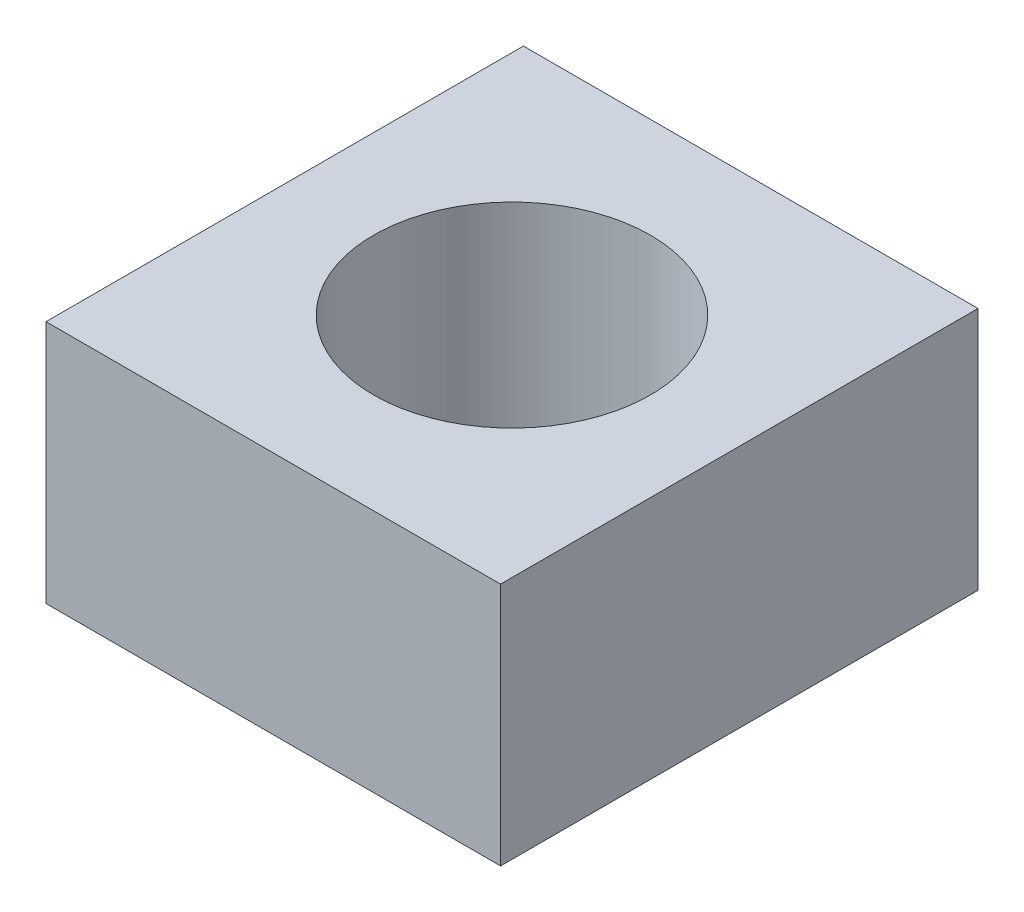
ISO-10303-21;
HEADER;
FILE_DESCRIPTION(('STEP AP214'),'2;1');
FILE_NAME('part.step','',(''),(''),'','','');
FILE_SCHEMA(('AUTOMOTIVE_DESIGN { 1 0 10303 214 1 1 1 1 }'));
ENDSEC;
DATA;
#1=APPLICATION_CONTEXT('core data for automotive mechanical design processes');
#2=APPLICATION_PROTOCOL_DEFINITION('international standard','automotive_design',2000,#1);
#3=PRODUCT_CONTEXT('',#1,'mechanical');
#4=PRODUCT('Part','Part','',(#3));
#5=PRODUCT_RELATED_PRODUCT_CATEGORY('part','',(#4));
#6=PRODUCT_DEFINITION_FORMATION('','',#4);
#7=PRODUCT_DEFINITION_CONTEXT('part definition',#1,'design');
#8=PRODUCT_DEFINITION('design','',#6,#7);
#9=PRODUCT_DEFINITION_SHAPE('','',#8);
#10=(LENGTH_UNIT() NAMED_UNIT(*) SI_UNIT(.MILLI.,.METRE.));
#11=(NAMED_UNIT(*) PLANE_ANGLE_UNIT() SI_UNIT($,.RADIAN.));
#12=(NAMED_UNIT(*) SI_UNIT($,.STERADIAN.) SOLID_ANGLE_UNIT());
#13=UNCERTAINTY_MEASURE_WITH_UNIT(LENGTH_MEASURE(1.E-05),#10,'distance_accuracy_value','');
#14=(GEOMETRIC_REPRESENTATION_CONTEXT(3) GLOBAL_UNCERTAINTY_ASSIGNED_CONTEXT((#13)) GLOBAL_UNIT_ASSIGNED_CONTEXT((#10,
#11,#12)) REPRESENTATION_CONTEXT('',''));
#15=CARTESIAN_POINT('',(0.,0.,0.));
#16=DIRECTION('',(0.,0.,1.));
#17=DIRECTION('',(1.,0.,0.));
#18=AXIS2_PLACEMENT_3D('',#15,#16,#17);
#19=CARTESIAN_POINT('',(0.,50.,0.));
#20=DIRECTION('',(0.,-1.,0.));
#21=DIRECTION('',(0.,0.,-1.));
#22=AXIS2_PLACEMENT_3D('',#19,#20,#21);
#23=PLANE('',#22);
#24=DIRECTION('',(0.,0.,-1.));
#25=VECTOR('',#24,1.);
#26=CARTESIAN_POINT('',(46.5564829141396,50.,48.8973116640126));
#27=LINE('',#26,#25);
#28=CARTESIAN_POINT('',(46.5564829141396,50.,48.8973116640126));
#29=VERTEX_POINT('',#28);
#30=CARTESIAN_POINT('',(46.5564829141396,50.,-48.8973116640126));
#31=VERTEX_POINT('',#30);
#32=EDGE_CURVE('E98',#29,#31,#27,.T.);
#33=ORIENTED_EDGE('',*,*,#32,.T.);
#34=DIRECTION('',(-1.,0.,0.));
#35=VECTOR('',#34,1.);
#36=CARTESIAN_POINT('',(-46.5564829141396,50.,-48.8973116640126));
#37=LINE('',#36,#35);
#38=CARTESIAN_POINT('',(-46.5564829141396,50.,-48.8973116640126));
#39=VERTEX_POINT('',#38);
#40=EDGE_CURVE('E93',#31,#39,#37,.T.);
#41=ORIENTED_EDGE('',*,*,#40,.T.);
#42=DIRECTION('',(0.,0.,1.));
#43=VECTOR('',#42,1.);
#44=CARTESIAN_POINT('',(-46.5564829141396,50.,48.8973116640126));
#45=LINE('',#44,#43);
#46=CARTESIAN_POINT('',(-46.5564829141396,50.,48.8973116640126));
#47=VERTEX_POINT('',#46);
#48=EDGE_CURVE('E96',#39,#47,#45,.T.);
#49=ORIENTED_EDGE('',*,*,#48,.T.);
#50=DIRECTION('',(1.,0.,0.));
#51=VECTOR('',#50,1.);
#52=CARTESIAN_POINT('',(-46.5564829141396,50.,48.8973116640126));
#53=LINE('',#52,#51);
#54=EDGE_CURVE('E63',#47,#29,#53,.T.);
#55=ORIENTED_EDGE('',*,*,#54,.T.);
#56=EDGE_LOOP('',(#33,#41,#49,#55));
#57=FACE_BOUND('',#56,.T.);
#58=CARTESIAN_POINT('',(0.,50.,0.));
#59=DIRECTION('',(0.,1.,0.));
#60=DIRECTION('',(0.,0.,1.));
#61=AXIS2_PLACEMENT_3D('',#58,#59,#60);
#62=CIRCLE('',#61,28.3607727956305);
#63=CARTESIAN_POINT('',(0.,50.,28.3607727956305));
#64=VERTEX_POINT('',#63);
#65=EDGE_CURVE('E118',#64,#64,#62,.T.);
#66=ORIENTED_EDGE('',*,*,#65,.F.);
#67=EDGE_LOOP('',(#66));
#68=FACE_BOUND('',#67,.T.);
#69=ADVANCED_FACE('F45',(#57,#68),#23,.F.);
#70=CARTESIAN_POINT('',(0.,0.,0.));
#71=DIRECTION('',(0.,-1.,0.));
#72=DIRECTION('',(0.,0.,-1.));
#73=AXIS2_PLACEMENT_3D('',#70,#71,#72);
#74=PLANE('',#73);
#75=DIRECTION('',(0.,0.,-1.));
#76=VECTOR('',#75,1.);
#77=CARTESIAN_POINT('',(46.5564829141396,0.,48.8973116640126));
#78=LINE('',#77,#76);
#79=CARTESIAN_POINT('',(46.5564829141396,0.,48.8973116640126));
#80=VERTEX_POINT('',#79);
#81=CARTESIAN_POINT('',(46.5564829141396,0.,-48.8973116640126));
#82=VERTEX_POINT('',#81);
#83=EDGE_CURVE('E114',#80,#82,#78,.T.);
#84=ORIENTED_EDGE('',*,*,#83,.F.);
#85=DIRECTION('',(1.,0.,0.));
#86=VECTOR('',#85,1.);
#87=CARTESIAN_POINT('',(-46.5564829141396,0.,48.8973116640126));
#88=LINE('',#87,#86);
#89=CARTESIAN_POINT('',(-46.5564829141396,0.,48.8973116640126));
#90=VERTEX_POINT('',#89);
#91=EDGE_CURVE('E86',#90,#80,#88,.T.);
#92=ORIENTED_EDGE('',*,*,#91,.F.);
#93=DIRECTION('',(0.,0.,1.));
#94=VECTOR('',#93,1.);
#95=CARTESIAN_POINT('',(-46.5564829141396,0.,48.8973116640126));
#96=LINE('',#95,#94);
#97=CARTESIAN_POINT('',(-46.5564829141396,0.,-48.8973116640126));
#98=VERTEX_POINT('',#97);
#99=EDGE_CURVE('E80',#98,#90,#96,.T.);
#100=ORIENTED_EDGE('',*,*,#99,.F.);
#101=DIRECTION('',(-1.,0.,0.));
#102=VECTOR('',#101,1.);
#103=CARTESIAN_POINT('',(-46.5564829141396,0.,-48.8973116640126));
#104=LINE('',#103,#102);
#105=EDGE_CURVE('E103',#82,#98,#104,.T.);
#106=ORIENTED_EDGE('',*,*,#105,.F.);
#107=EDGE_LOOP('',(#84,#92,#100,#106));
#108=FACE_BOUND('',#107,.T.);
#109=CARTESIAN_POINT('',(0.,0.,0.));
#110=DIRECTION('',(0.,1.,0.));
#111=DIRECTION('',(0.,0.,1.));
#112=AXIS2_PLACEMENT_3D('',#109,#110,#111);
#113=CIRCLE('',#112,28.3607727956305);
#114=CARTESIAN_POINT('',(0.,0.,28.3607727956305));
#115=VERTEX_POINT('',#114);
#116=EDGE_CURVE('E136',#115,#115,#113,.T.);
#117=ORIENTED_EDGE('',*,*,#116,.T.);
#118=EDGE_LOOP('',(#117));
#119=FACE_BOUND('',#118,.T.);
#120=ADVANCED_FACE('F131',(#108,#119),#74,.T.);
#121=CARTESIAN_POINT('',(46.5564829141396,50.,48.8973116640126));
#122=DIRECTION('',(-1.,0.,0.));
#123=DIRECTION('',(0.,0.,1.));
#124=AXIS2_PLACEMENT_3D('',#121,#122,#123);
#125=PLANE('',#124);
#126=ORIENTED_EDGE('',*,*,#83,.T.);
#127=DIRECTION('',(0.,-1.,0.));
#128=VECTOR('',#127,1.);
#129=CARTESIAN_POINT('',(46.5564829141396,50.,-48.8973116640126));
#130=LINE('',#129,#128);
#131=EDGE_CURVE('E11',#31,#82,#130,.T.);
#132=ORIENTED_EDGE('',*,*,#131,.F.);
#133=ORIENTED_EDGE('',*,*,#32,.F.);
#134=DIRECTION('',(0.,-1.,0.));
#135=VECTOR('',#134,1.);
#136=CARTESIAN_POINT('',(46.5564829141396,50.,48.8973116640126));
#137=LINE('',#136,#135);
#138=EDGE_CURVE('E110',#29,#80,#137,.T.);
#139=ORIENTED_EDGE('',*,*,#138,.T.);
#140=EDGE_LOOP('',(#126,#132,#133,#139));
#141=FACE_BOUND('',#140,.T.);
#142=ADVANCED_FACE('F47',(#141),#125,.F.);
#143=CARTESIAN_POINT('',(-46.5564829141396,50.,-48.8973116640126));
#144=DIRECTION('',(0.,0.,1.));
#145=DIRECTION('',(1.,0.,0.));
#146=AXIS2_PLACEMENT_3D('',#143,#144,#145);
#147=PLANE('',#146);
#148=ORIENTED_EDGE('',*,*,#105,.T.);
#149=DIRECTION('',(0.,-1.,0.));
#150=VECTOR('',#149,1.);
#151=CARTESIAN_POINT('',(-46.5564829141396,50.,-48.8973116640126));
#152=LINE('',#151,#150);
#153=EDGE_CURVE('E55',#39,#98,#152,.T.);
#154=ORIENTED_EDGE('',*,*,#153,.F.);
#155=ORIENTED_EDGE('',*,*,#40,.F.);
#156=ORIENTED_EDGE('',*,*,#131,.T.);
#157=EDGE_LOOP('',(#148,#154,#155,#156));
#158=FACE_BOUND('',#157,.T.);
#159=ADVANCED_FACE('F102',(#158),#147,.F.);
#160=CARTESIAN_POINT('',(-46.5564829141396,50.,48.8973116640126));
#161=DIRECTION('',(1.,0.,0.));
#162=DIRECTION('',(0.,0.,-1.));
#163=AXIS2_PLACEMENT_3D('',#160,#161,#162);
#164=PLANE('',#163);
#165=ORIENTED_EDGE('',*,*,#99,.T.);
#166=DIRECTION('',(0.,-1.,0.));
#167=VECTOR('',#166,1.);
#168=CARTESIAN_POINT('',(-46.5564829141396,50.,48.8973116640126));
#169=LINE('',#168,#167);
#170=EDGE_CURVE('E105',#47,#90,#169,.T.);
#171=ORIENTED_EDGE('',*,*,#170,.F.);
#172=ORIENTED_EDGE('',*,*,#48,.F.);
#173=ORIENTED_EDGE('',*,*,#153,.T.);
#174=EDGE_LOOP('',(#165,#171,#172,#173));
#175=FACE_BOUND('',#174,.T.);
#176=ADVANCED_FACE('F106',(#175),#164,.F.);
#177=CARTESIAN_POINT('',(-46.5564829141396,50.,48.8973116640126));
#178=DIRECTION('',(0.,0.,-1.));
#179=DIRECTION('',(-1.,0.,0.));
#180=AXIS2_PLACEMENT_3D('',#177,#178,#179);
#181=PLANE('',#180);
#182=ORIENTED_EDGE('',*,*,#91,.T.);
#183=ORIENTED_EDGE('',*,*,#138,.F.);
#184=ORIENTED_EDGE('',*,*,#54,.F.);
#185=ORIENTED_EDGE('',*,*,#170,.T.);
#186=EDGE_LOOP('',(#182,#183,#184,#185));
#187=FACE_BOUND('',#186,.T.);
#188=ADVANCED_FACE('F128',(#187),#181,.F.);
#189=CARTESIAN_POINT('',(0.,50.,0.));
#190=DIRECTION('',(0.,-1.,0.));
#191=DIRECTION('',(0.,0.,-1.));
#192=AXIS2_PLACEMENT_3D('',#189,#190,#191);
#193=CYLINDRICAL_SURFACE('',#192,28.3607727956305);
#194=ORIENTED_EDGE('',*,*,#65,.T.);
#195=EDGE_LOOP('',(#194));
#196=FACE_BOUND('',#195,.T.);
#197=ORIENTED_EDGE('',*,*,#116,.F.);
#198=EDGE_LOOP('',(#197));
#199=FACE_BOUND('',#198,.T.);
#200=ADVANCED_FACE('F144',(#196,#199),#193,.F.);
#201=CLOSED_SHELL('',(#69,#120,#142,#159,#176,#188,#200));
#202=MANIFOLD_SOLID_BREP('B2',#201);
#203=ADVANCED_BREP_SHAPE_REPRESENTATION('',(#18,#202),#14);
#204=SHAPE_DEFINITION_REPRESENTATION(#9,#203);
ENDSEC;
END-ISO-10303-21;
